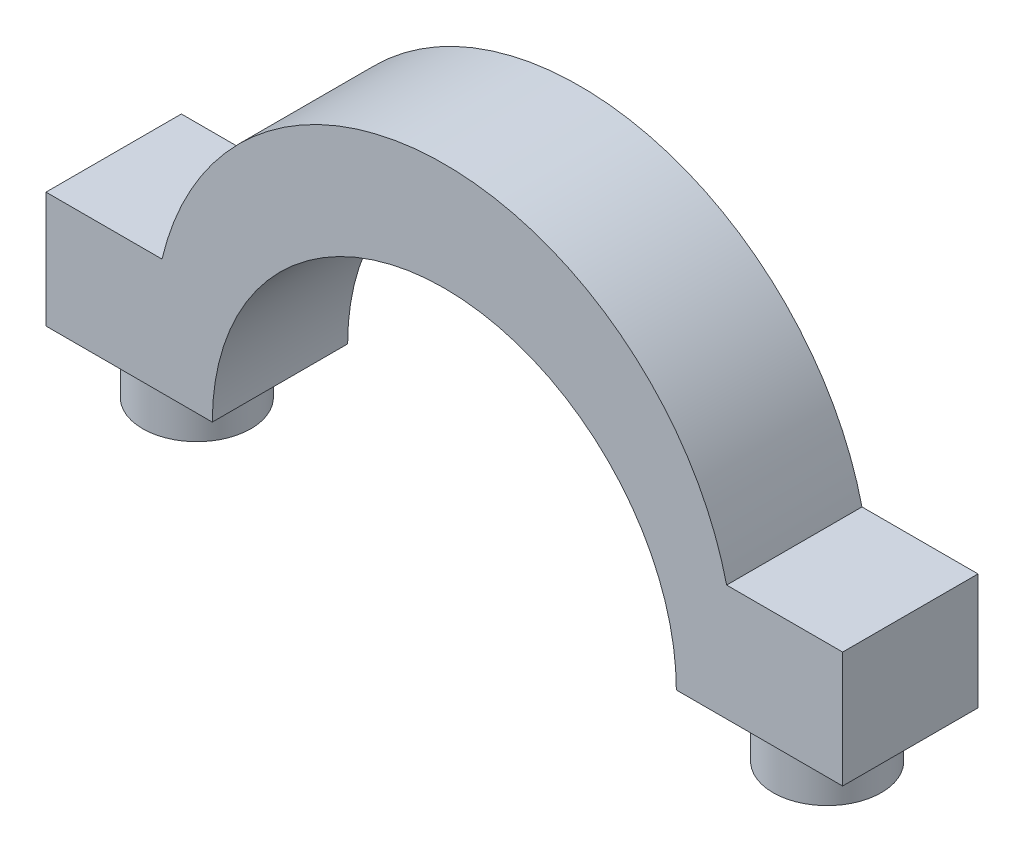
ISO-10303-21;
HEADER;
FILE_DESCRIPTION(('STEP AP214'),'2;1');
FILE_NAME('part.step','',(''),(''),'','','');
FILE_SCHEMA(('AUTOMOTIVE_DESIGN { 1 0 10303 214 1 1 1 1 }'));
ENDSEC;
DATA;
#1=APPLICATION_CONTEXT('core data for automotive mechanical design processes');
#2=APPLICATION_PROTOCOL_DEFINITION('international standard','automotive_design',2000,#1);
#3=PRODUCT_CONTEXT('',#1,'mechanical');
#4=PRODUCT('Part','Part','',(#3));
#5=PRODUCT_RELATED_PRODUCT_CATEGORY('part','',(#4));
#6=PRODUCT_DEFINITION_FORMATION('','',#4);
#7=PRODUCT_DEFINITION_CONTEXT('part definition',#1,'design');
#8=PRODUCT_DEFINITION('design','',#6,#7);
#9=PRODUCT_DEFINITION_SHAPE('','',#8);
#10=(LENGTH_UNIT() NAMED_UNIT(*) SI_UNIT(.MILLI.,.METRE.));
#11=(NAMED_UNIT(*) PLANE_ANGLE_UNIT() SI_UNIT($,.RADIAN.));
#12=(NAMED_UNIT(*) SI_UNIT($,.STERADIAN.) SOLID_ANGLE_UNIT());
#13=UNCERTAINTY_MEASURE_WITH_UNIT(LENGTH_MEASURE(1.E-05),#10,'distance_accuracy_value','');
#14=(GEOMETRIC_REPRESENTATION_CONTEXT(3) GLOBAL_UNCERTAINTY_ASSIGNED_CONTEXT((#13)) GLOBAL_UNIT_ASSIGNED_CONTEXT((#10,
#11,#12)) REPRESENTATION_CONTEXT('',''));
#15=CARTESIAN_POINT('',(0.,0.,0.));
#16=DIRECTION('',(0.,0.,1.));
#17=DIRECTION('',(1.,0.,0.));
#18=AXIS2_PLACEMENT_3D('',#15,#16,#17);
#19=CARTESIAN_POINT('',(-6.94481012658228,0.,8.89));
#20=DIRECTION('',(0.,0.,-1.));
#21=DIRECTION('',(-1.,0.,0.));
#22=AXIS2_PLACEMENT_3D('',#19,#20,#21);
#23=CYLINDRICAL_SURFACE('',#22,15.24);
#24=CARTESIAN_POINT('',(-6.94481012658228,0.,0.));
#25=DIRECTION('',(0.,0.,-1.));
#26=DIRECTION('',(-1.,0.,0.));
#27=AXIS2_PLACEMENT_3D('',#24,#25,#26);
#28=CIRCLE('',#27,15.24);
#29=CARTESIAN_POINT('',(-22.1848101265823,0.,0.));
#30=VERTEX_POINT('',#29);
#31=CARTESIAN_POINT('',(8.29518987341772,0.,0.));
#32=VERTEX_POINT('',#31);
#33=EDGE_CURVE('E147',#30,#32,#28,.T.);
#34=ORIENTED_EDGE('',*,*,#33,.T.);
#35=DIRECTION('',(0.,0.,-1.));
#36=VECTOR('',#35,1.);
#37=CARTESIAN_POINT('',(8.29518987341772,0.,8.89));
#38=LINE('',#37,#36);
#39=CARTESIAN_POINT('',(8.29518987341772,0.,8.89));
#40=VERTEX_POINT('',#39);
#41=EDGE_CURVE('E189',#40,#32,#38,.T.);
#42=ORIENTED_EDGE('',*,*,#41,.F.);
#43=CARTESIAN_POINT('',(-6.94481012658228,0.,8.89));
#44=DIRECTION('',(0.,0.,-1.));
#45=DIRECTION('',(-1.,0.,0.));
#46=AXIS2_PLACEMENT_3D('',#43,#44,#45);
#47=CIRCLE('',#46,15.24);
#48=CARTESIAN_POINT('',(-22.1848101265823,0.,8.89));
#49=VERTEX_POINT('',#48);
#50=EDGE_CURVE('E170',#49,#40,#47,.T.);
#51=ORIENTED_EDGE('',*,*,#50,.F.);
#52=DIRECTION('',(0.,0.,-1.));
#53=VECTOR('',#52,1.);
#54=CARTESIAN_POINT('',(-22.1848101265823,0.,8.89));
#55=LINE('',#54,#53);
#56=EDGE_CURVE('E143',#49,#30,#55,.T.);
#57=ORIENTED_EDGE('',*,*,#56,.T.);
#58=EDGE_LOOP('',(#34,#42,#51,#57));
#59=FACE_BOUND('',#58,.T.);
#60=ADVANCED_FACE('F45',(#59),#23,.F.);
#61=CARTESIAN_POINT('',(8.29518987341772,0.,8.89));
#62=DIRECTION('',(0.,1.,0.));
#63=DIRECTION('',(0.,0.,1.));
#64=AXIS2_PLACEMENT_3D('',#61,#62,#63);
#65=PLANE('',#64);
#66=CARTESIAN_POINT('',(13.7561898734177,0.,4.445));
#67=DIRECTION('',(0.,1.,0.));
#68=DIRECTION('',(0.,0.,1.));
#69=AXIS2_PLACEMENT_3D('',#66,#67,#68);
#70=CIRCLE('',#69,3.556);
#71=CARTESIAN_POINT('',(13.7561898734177,0.,8.001));
#72=VERTEX_POINT('',#71);
#73=EDGE_CURVE('E11',#72,#72,#70,.F.);
#74=ORIENTED_EDGE('',*,*,#73,.F.);
#75=EDGE_LOOP('',(#74));
#76=FACE_BOUND('',#75,.T.);
#77=DIRECTION('',(1.,0.,0.));
#78=VECTOR('',#77,1.);
#79=CARTESIAN_POINT('',(8.29518987341772,0.,0.));
#80=LINE('',#79,#78);
#81=CARTESIAN_POINT('',(19.2171898734177,0.,0.));
#82=VERTEX_POINT('',#81);
#83=EDGE_CURVE('E151',#32,#82,#80,.T.);
#84=ORIENTED_EDGE('',*,*,#83,.T.);
#85=DIRECTION('',(0.,0.,-1.));
#86=VECTOR('',#85,1.);
#87=CARTESIAN_POINT('',(19.2171898734177,0.,8.89));
#88=LINE('',#87,#86);
#89=CARTESIAN_POINT('',(19.2171898734177,0.,8.89));
#90=VERTEX_POINT('',#89);
#91=EDGE_CURVE('E185',#90,#82,#88,.T.);
#92=ORIENTED_EDGE('',*,*,#91,.F.);
#93=DIRECTION('',(1.,0.,0.));
#94=VECTOR('',#93,1.);
#95=CARTESIAN_POINT('',(8.29518987341772,0.,8.89));
#96=LINE('',#95,#94);
#97=EDGE_CURVE('E106',#40,#90,#96,.T.);
#98=ORIENTED_EDGE('',*,*,#97,.F.);
#99=ORIENTED_EDGE('',*,*,#41,.T.);
#100=EDGE_LOOP('',(#84,#92,#98,#99));
#101=FACE_BOUND('',#100,.T.);
#102=ADVANCED_FACE('F211',(#76,#101),#65,.F.);
#103=CARTESIAN_POINT('',(19.2171898734177,0.,8.89));
#104=DIRECTION('',(-1.,0.,0.));
#105=DIRECTION('',(0.,0.,1.));
#106=AXIS2_PLACEMENT_3D('',#103,#104,#105);
#107=PLANE('',#106);
#108=DIRECTION('',(0.,1.,0.));
#109=VECTOR('',#108,1.);
#110=CARTESIAN_POINT('',(19.2171898734177,0.,0.));
#111=LINE('',#110,#109);
#112=CARTESIAN_POINT('',(19.2171898734177,7.62,0.));
#113=VERTEX_POINT('',#112);
#114=EDGE_CURVE('E155',#82,#113,#111,.T.);
#115=ORIENTED_EDGE('',*,*,#114,.T.);
#116=DIRECTION('',(0.,0.,-1.));
#117=VECTOR('',#116,1.);
#118=CARTESIAN_POINT('',(19.2171898734177,7.62,8.89));
#119=LINE('',#118,#117);
#120=CARTESIAN_POINT('',(19.2171898734177,7.62,8.89));
#121=VERTEX_POINT('',#120);
#122=EDGE_CURVE('E181',#121,#113,#119,.T.);
#123=ORIENTED_EDGE('',*,*,#122,.F.);
#124=DIRECTION('',(0.,1.,0.));
#125=VECTOR('',#124,1.);
#126=CARTESIAN_POINT('',(19.2171898734177,0.,8.89));
#127=LINE('',#126,#125);
#128=EDGE_CURVE('E227',#90,#121,#127,.T.);
#129=ORIENTED_EDGE('',*,*,#128,.F.);
#130=ORIENTED_EDGE('',*,*,#91,.T.);
#131=EDGE_LOOP('',(#115,#123,#129,#130));
#132=FACE_BOUND('',#131,.T.);
#133=ADVANCED_FACE('F216',(#132),#107,.F.);
#134=CARTESIAN_POINT('',(19.2171898734177,7.62,8.89));
#135=DIRECTION('',(0.,-1.,0.));
#136=DIRECTION('',(0.,0.,-1.));
#137=AXIS2_PLACEMENT_3D('',#134,#135,#136);
#138=PLANE('',#137);
#139=DIRECTION('',(-1.,0.,0.));
#140=VECTOR('',#139,1.);
#141=CARTESIAN_POINT('',(19.2171898734177,7.62,0.));
#142=LINE('',#141,#140);
#143=CARTESIAN_POINT('',(11.5971898734177,7.61999999999999,0.));
#144=VERTEX_POINT('',#143);
#145=EDGE_CURVE('E158',#113,#144,#142,.T.);
#146=ORIENTED_EDGE('',*,*,#145,.T.);
#147=DIRECTION('',(0.,0.,-1.));
#148=VECTOR('',#147,1.);
#149=CARTESIAN_POINT('',(11.5971898734177,7.61999999999999,8.89));
#150=LINE('',#149,#148);
#151=CARTESIAN_POINT('',(11.5971898734177,7.61999999999999,8.89));
#152=VERTEX_POINT('',#151);
#153=EDGE_CURVE('E177',#152,#144,#150,.T.);
#154=ORIENTED_EDGE('',*,*,#153,.F.);
#155=DIRECTION('',(-1.,0.,0.));
#156=VECTOR('',#155,1.);
#157=CARTESIAN_POINT('',(19.2171898734177,7.62,8.89));
#158=LINE('',#157,#156);
#159=EDGE_CURVE('E230',#121,#152,#158,.T.);
#160=ORIENTED_EDGE('',*,*,#159,.F.);
#161=ORIENTED_EDGE('',*,*,#122,.T.);
#162=EDGE_LOOP('',(#146,#154,#160,#161));
#163=FACE_BOUND('',#162,.T.);
#164=ADVANCED_FACE('F324',(#163),#138,.F.);
#165=CARTESIAN_POINT('',(-6.94481012658228,3.25001876434235,8.89));
#166=DIRECTION('',(0.,0.,-1.));
#167=DIRECTION('',(-1.,0.,0.));
#168=AXIS2_PLACEMENT_3D('',#165,#166,#167);
#169=CYLINDRICAL_SURFACE('',#168,19.05);
#170=CARTESIAN_POINT('',(-6.94481012658228,3.25001876434235,0.));
#171=DIRECTION('',(0.,0.,1.));
#172=DIRECTION('',(-1.,0.,0.));
#173=AXIS2_PLACEMENT_3D('',#170,#171,#172);
#174=CIRCLE('',#173,19.05);
#175=CARTESIAN_POINT('',(-25.4868101265823,7.62,0.));
#176=VERTEX_POINT('',#175);
#177=EDGE_CURVE('E161',#144,#176,#174,.T.);
#178=ORIENTED_EDGE('',*,*,#177,.T.);
#179=DIRECTION('',(0.,0.,-1.));
#180=VECTOR('',#179,1.);
#181=CARTESIAN_POINT('',(-25.4868101265823,7.62,8.89));
#182=LINE('',#181,#180);
#183=CARTESIAN_POINT('',(-25.4868101265823,7.62,8.89));
#184=VERTEX_POINT('',#183);
#185=EDGE_CURVE('E136',#184,#176,#182,.T.);
#186=ORIENTED_EDGE('',*,*,#185,.F.);
#187=CARTESIAN_POINT('',(-6.94481012658228,3.25001876434235,8.89));
#188=DIRECTION('',(0.,0.,1.));
#189=DIRECTION('',(-1.,0.,0.));
#190=AXIS2_PLACEMENT_3D('',#187,#188,#189);
#191=CIRCLE('',#190,19.05);
#192=EDGE_CURVE('E125',#152,#184,#191,.T.);
#193=ORIENTED_EDGE('',*,*,#192,.F.);
#194=ORIENTED_EDGE('',*,*,#153,.T.);
#195=EDGE_LOOP('',(#178,#186,#193,#194));
#196=FACE_BOUND('',#195,.T.);
#197=ADVANCED_FACE('F315',(#196),#169,.T.);
#198=CARTESIAN_POINT('',(-33.1068101265823,7.62,8.89));
#199=DIRECTION('',(0.,-1.,0.));
#200=DIRECTION('',(0.,0.,-1.));
#201=AXIS2_PLACEMENT_3D('',#198,#199,#200);
#202=PLANE('',#201);
#203=DIRECTION('',(-1.,0.,0.));
#204=VECTOR('',#203,1.);
#205=CARTESIAN_POINT('',(-33.1068101265823,7.62,0.));
#206=LINE('',#205,#204);
#207=CARTESIAN_POINT('',(-33.1068101265823,7.62,0.));
#208=VERTEX_POINT('',#207);
#209=EDGE_CURVE('E134',#176,#208,#206,.T.);
#210=ORIENTED_EDGE('',*,*,#209,.T.);
#211=DIRECTION('',(0.,0.,-1.));
#212=VECTOR('',#211,1.);
#213=CARTESIAN_POINT('',(-33.1068101265823,7.62,8.89));
#214=LINE('',#213,#212);
#215=CARTESIAN_POINT('',(-33.1068101265823,7.62,8.89));
#216=VERTEX_POINT('',#215);
#217=EDGE_CURVE('E131',#216,#208,#214,.T.);
#218=ORIENTED_EDGE('',*,*,#217,.F.);
#219=DIRECTION('',(-1.,0.,0.));
#220=VECTOR('',#219,1.);
#221=CARTESIAN_POINT('',(-33.1068101265823,7.62,8.89));
#222=LINE('',#221,#220);
#223=EDGE_CURVE('E119',#184,#216,#222,.T.);
#224=ORIENTED_EDGE('',*,*,#223,.F.);
#225=ORIENTED_EDGE('',*,*,#185,.T.);
#226=EDGE_LOOP('',(#210,#218,#224,#225));
#227=FACE_BOUND('',#226,.T.);
#228=ADVANCED_FACE('F132',(#227),#202,.F.);
#229=CARTESIAN_POINT('',(-33.1068101265823,0.,8.89));
#230=DIRECTION('',(1.,0.,0.));
#231=DIRECTION('',(0.,0.,-1.));
#232=AXIS2_PLACEMENT_3D('',#229,#230,#231);
#233=PLANE('',#232);
#234=DIRECTION('',(0.,-1.,0.));
#235=VECTOR('',#234,1.);
#236=CARTESIAN_POINT('',(-33.1068101265823,0.,0.));
#237=LINE('',#236,#235);
#238=CARTESIAN_POINT('',(-33.1068101265823,0.,0.));
#239=VERTEX_POINT('',#238);
#240=EDGE_CURVE('E91',#208,#239,#237,.T.);
#241=ORIENTED_EDGE('',*,*,#240,.T.);
#242=DIRECTION('',(0.,0.,-1.));
#243=VECTOR('',#242,1.);
#244=CARTESIAN_POINT('',(-33.1068101265823,0.,8.89));
#245=LINE('',#244,#243);
#246=CARTESIAN_POINT('',(-33.1068101265823,0.,8.89));
#247=VERTEX_POINT('',#246);
#248=EDGE_CURVE('E137',#247,#239,#245,.T.);
#249=ORIENTED_EDGE('',*,*,#248,.F.);
#250=DIRECTION('',(0.,-1.,0.));
#251=VECTOR('',#250,1.);
#252=CARTESIAN_POINT('',(-33.1068101265823,0.,8.89));
#253=LINE('',#252,#251);
#254=EDGE_CURVE('E123',#216,#247,#253,.T.);
#255=ORIENTED_EDGE('',*,*,#254,.F.);
#256=ORIENTED_EDGE('',*,*,#217,.T.);
#257=EDGE_LOOP('',(#241,#249,#255,#256));
#258=FACE_BOUND('',#257,.T.);
#259=ADVANCED_FACE('F139',(#258),#233,.F.);
#260=CARTESIAN_POINT('',(-22.1848101265823,0.,8.89));
#261=DIRECTION('',(0.,1.,0.));
#262=DIRECTION('',(0.,0.,1.));
#263=AXIS2_PLACEMENT_3D('',#260,#261,#262);
#264=PLANE('',#263);
#265=CARTESIAN_POINT('',(-27.6458101265823,0.,4.445));
#266=DIRECTION('',(0.,1.,0.));
#267=DIRECTION('',(0.,0.,1.));
#268=AXIS2_PLACEMENT_3D('',#265,#266,#267);
#269=CIRCLE('',#268,3.556);
#270=CARTESIAN_POINT('',(-27.6458101265823,0.,8.001));
#271=VERTEX_POINT('',#270);
#272=EDGE_CURVE('E54',#271,#271,#269,.F.);
#273=ORIENTED_EDGE('',*,*,#272,.F.);
#274=EDGE_LOOP('',(#273));
#275=FACE_BOUND('',#274,.T.);
#276=DIRECTION('',(1.,0.,0.));
#277=VECTOR('',#276,1.);
#278=CARTESIAN_POINT('',(-22.1848101265823,0.,0.));
#279=LINE('',#278,#277);
#280=EDGE_CURVE('E97',#239,#30,#279,.T.);
#281=ORIENTED_EDGE('',*,*,#280,.T.);
#282=ORIENTED_EDGE('',*,*,#56,.F.);
#283=DIRECTION('',(1.,0.,0.));
#284=VECTOR('',#283,1.);
#285=CARTESIAN_POINT('',(-22.1848101265823,0.,8.89));
#286=LINE('',#285,#284);
#287=EDGE_CURVE('E62',#247,#49,#286,.T.);
#288=ORIENTED_EDGE('',*,*,#287,.F.);
#289=ORIENTED_EDGE('',*,*,#248,.T.);
#290=EDGE_LOOP('',(#281,#282,#288,#289));
#291=FACE_BOUND('',#290,.T.);
#292=ADVANCED_FACE('F197',(#275,#291),#264,.F.);
#293=CARTESIAN_POINT('',(-6.94481012658228,0.,8.89));
#294=DIRECTION('',(0.,0.,-1.));
#295=DIRECTION('',(-1.,0.,0.));
#296=AXIS2_PLACEMENT_3D('',#293,#294,#295);
#297=PLANE('',#296);
#298=ORIENTED_EDGE('',*,*,#50,.T.);
#299=ORIENTED_EDGE('',*,*,#97,.T.);
#300=ORIENTED_EDGE('',*,*,#128,.T.);
#301=ORIENTED_EDGE('',*,*,#159,.T.);
#302=ORIENTED_EDGE('',*,*,#192,.T.);
#303=ORIENTED_EDGE('',*,*,#223,.T.);
#304=ORIENTED_EDGE('',*,*,#254,.T.);
#305=ORIENTED_EDGE('',*,*,#287,.T.);
#306=EDGE_LOOP('',(#298,#299,#300,#301,#302,#303,#304,#305));
#307=FACE_BOUND('',#306,.T.);
#308=ADVANCED_FACE('F121',(#307),#297,.F.);
#309=CARTESIAN_POINT('',(-6.94481012658228,0.,0.));
#310=DIRECTION('',(0.,0.,-1.));
#311=DIRECTION('',(-1.,0.,0.));
#312=AXIS2_PLACEMENT_3D('',#309,#310,#311);
#313=PLANE('',#312);
#314=ORIENTED_EDGE('',*,*,#33,.F.);
#315=ORIENTED_EDGE('',*,*,#280,.F.);
#316=ORIENTED_EDGE('',*,*,#240,.F.);
#317=ORIENTED_EDGE('',*,*,#209,.F.);
#318=ORIENTED_EDGE('',*,*,#177,.F.);
#319=ORIENTED_EDGE('',*,*,#145,.F.);
#320=ORIENTED_EDGE('',*,*,#114,.F.);
#321=ORIENTED_EDGE('',*,*,#83,.F.);
#322=EDGE_LOOP('',(#314,#315,#316,#317,#318,#319,#320,#321));
#323=FACE_BOUND('',#322,.T.);
#324=ADVANCED_FACE('F205',(#323),#313,.T.);
#325=CARTESIAN_POINT('',(-27.6458101265823,-3.556,4.445));
#326=DIRECTION('',(0.,1.,0.));
#327=DIRECTION('',(0.,0.,1.));
#328=AXIS2_PLACEMENT_3D('',#325,#326,#327);
#329=CYLINDRICAL_SURFACE('',#328,3.556);
#330=CARTESIAN_POINT('',(-27.6458101265823,-3.556,4.445));
#331=DIRECTION('',(0.,-1.,0.));
#332=DIRECTION('',(0.,0.,-1.));
#333=AXIS2_PLACEMENT_3D('',#330,#331,#332);
#334=CIRCLE('',#333,3.556);
#335=CARTESIAN_POINT('',(-27.6458101265823,-3.556,0.889));
#336=VERTEX_POINT('',#335);
#337=EDGE_CURVE('E152',#336,#336,#334,.T.);
#338=ORIENTED_EDGE('',*,*,#337,.F.);
#339=EDGE_LOOP('',(#338));
#340=FACE_BOUND('',#339,.T.);
#341=ORIENTED_EDGE('',*,*,#272,.T.);
#342=EDGE_LOOP('',(#341));
#343=FACE_BOUND('',#342,.T.);
#344=ADVANCED_FACE('F195',(#340,#343),#329,.T.);
#345=CARTESIAN_POINT('',(-27.6458101265823,-3.556,4.445));
#346=DIRECTION('',(0.,-1.,0.));
#347=DIRECTION('',(0.,0.,-1.));
#348=AXIS2_PLACEMENT_3D('',#345,#346,#347);
#349=PLANE('',#348);
#350=ORIENTED_EDGE('',*,*,#337,.T.);
#351=EDGE_LOOP('',(#350));
#352=FACE_BOUND('',#351,.T.);
#353=ADVANCED_FACE('F248',(#352),#349,.T.);
#354=CARTESIAN_POINT('',(13.7561898734177,-3.556,4.445));
#355=DIRECTION('',(0.,1.,0.));
#356=DIRECTION('',(0.,0.,1.));
#357=AXIS2_PLACEMENT_3D('',#354,#355,#356);
#358=CYLINDRICAL_SURFACE('',#357,3.556);
#359=CARTESIAN_POINT('',(13.7561898734177,-3.556,4.445));
#360=DIRECTION('',(0.,-1.,0.));
#361=DIRECTION('',(0.,0.,1.));
#362=AXIS2_PLACEMENT_3D('',#359,#360,#361);
#363=CIRCLE('',#362,3.556);
#364=CARTESIAN_POINT('',(13.7561898734177,-3.556,8.001));
#365=VERTEX_POINT('',#364);
#366=EDGE_CURVE('E240',#365,#365,#363,.T.);
#367=ORIENTED_EDGE('',*,*,#366,.F.);
#368=EDGE_LOOP('',(#367));
#369=FACE_BOUND('',#368,.T.);
#370=ORIENTED_EDGE('',*,*,#73,.T.);
#371=EDGE_LOOP('',(#370));
#372=FACE_BOUND('',#371,.T.);
#373=ADVANCED_FACE('F254',(#369,#372),#358,.T.);
#374=CARTESIAN_POINT('',(13.7561898734177,-3.556,4.445));
#375=DIRECTION('',(0.,1.,0.));
#376=DIRECTION('',(0.,0.,1.));
#377=AXIS2_PLACEMENT_3D('',#374,#375,#376);
#378=PLANE('',#377);
#379=ORIENTED_EDGE('',*,*,#366,.T.);
#380=EDGE_LOOP('',(#379));
#381=FACE_BOUND('',#380,.T.);
#382=ADVANCED_FACE('F260',(#381),#378,.F.);
#383=CLOSED_SHELL('',(#60,#102,#133,#164,#197,#228,#259,#292,#308,#324,#344,#353,#373,#382));
#384=MANIFOLD_SOLID_BREP('B2',#383);
#385=ADVANCED_BREP_SHAPE_REPRESENTATION('',(#18,#384),#14);
#386=SHAPE_DEFINITION_REPRESENTATION(#9,#385);
ENDSEC;
END-ISO-10303-21;
